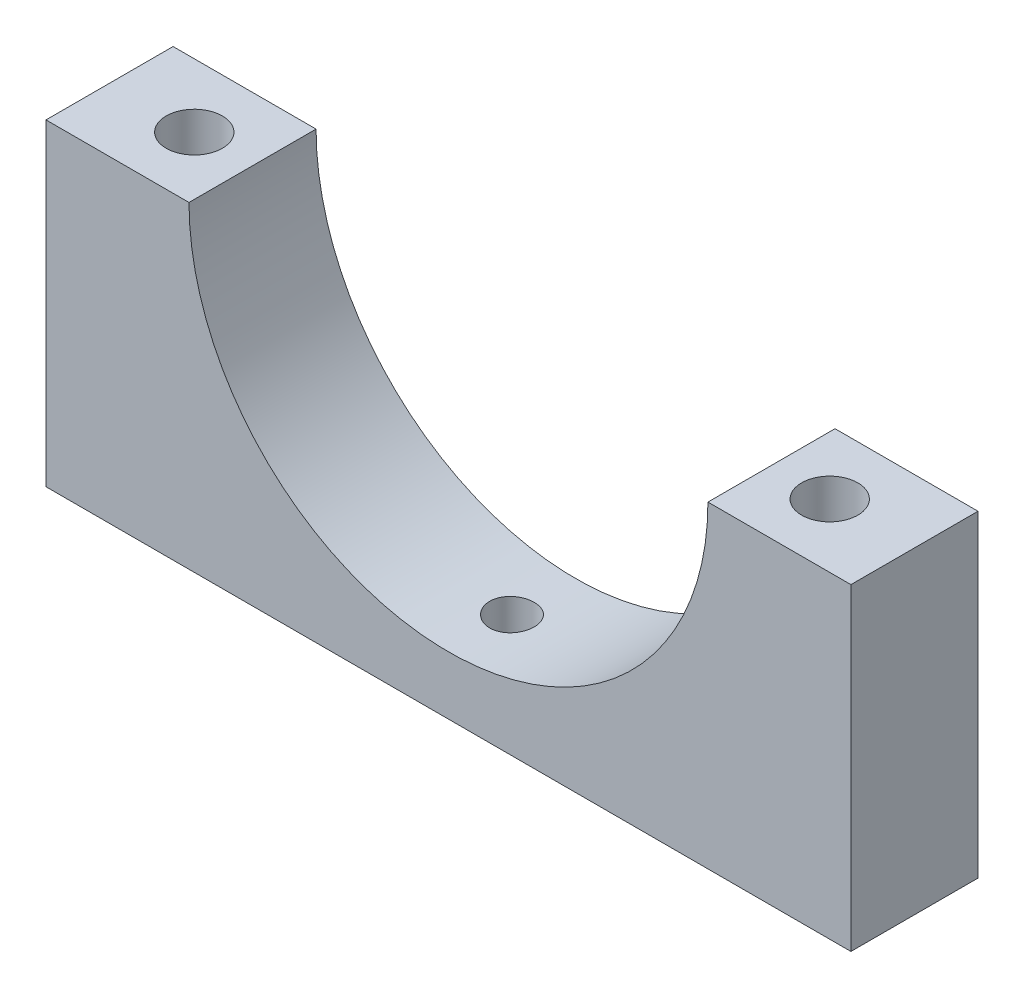
ISO-10303-21;
HEADER;
FILE_DESCRIPTION(('STEP AP214'),'2;1');
FILE_NAME('part.step','',(''),(''),'','','');
FILE_SCHEMA(('AUTOMOTIVE_DESIGN { 1 0 10303 214 1 1 1 1 }'));
ENDSEC;
DATA;
#1=APPLICATION_CONTEXT('core data for automotive mechanical design processes');
#2=APPLICATION_PROTOCOL_DEFINITION('international standard','automotive_design',2000,#1);
#3=PRODUCT_CONTEXT('',#1,'mechanical');
#4=PRODUCT('Part','Part','',(#3));
#5=PRODUCT_RELATED_PRODUCT_CATEGORY('part','',(#4));
#6=PRODUCT_DEFINITION_FORMATION('','',#4);
#7=PRODUCT_DEFINITION_CONTEXT('part definition',#1,'design');
#8=PRODUCT_DEFINITION('design','',#6,#7);
#9=PRODUCT_DEFINITION_SHAPE('','',#8);
#10=(LENGTH_UNIT() NAMED_UNIT(*) SI_UNIT(.MILLI.,.METRE.));
#11=(NAMED_UNIT(*) PLANE_ANGLE_UNIT() SI_UNIT($,.RADIAN.));
#12=(NAMED_UNIT(*) SI_UNIT($,.STERADIAN.) SOLID_ANGLE_UNIT());
#13=UNCERTAINTY_MEASURE_WITH_UNIT(LENGTH_MEASURE(1.E-05),#10,'distance_accuracy_value','');
#14=(GEOMETRIC_REPRESENTATION_CONTEXT(3) GLOBAL_UNCERTAINTY_ASSIGNED_CONTEXT((#13)) GLOBAL_UNIT_ASSIGNED_CONTEXT((#10,
#11,#12)) REPRESENTATION_CONTEXT('',''));
#15=CARTESIAN_POINT('',(0.,0.,0.));
#16=DIRECTION('',(0.,0.,1.));
#17=DIRECTION('',(1.,0.,0.));
#18=AXIS2_PLACEMENT_3D('',#15,#16,#17);
#19=CARTESIAN_POINT('',(-38.,0.,6.));
#20=DIRECTION('',(0.,1.,0.));
#21=DIRECTION('',(0.,0.,1.));
#22=AXIS2_PLACEMENT_3D('',#19,#20,#21);
#23=PLANE('',#22);
#24=CARTESIAN_POINT('',(-30.,0.,0.));
#25=DIRECTION('',(0.,-1.,0.));
#26=DIRECTION('',(0.,0.,-1.));
#27=AXIS2_PLACEMENT_3D('',#24,#25,#26);
#28=CIRCLE('',#27,2.64999999999999);
#29=CARTESIAN_POINT('',(-30.,0.,-2.64999999999999));
#30=VERTEX_POINT('',#29);
#31=EDGE_CURVE('E267',#30,#30,#28,.T.);
#32=ORIENTED_EDGE('',*,*,#31,.T.);
#33=EDGE_LOOP('',(#32));
#34=FACE_BOUND('',#33,.T.);
#35=DIRECTION('',(0.,0.,1.));
#36=VECTOR('',#35,1.);
#37=CARTESIAN_POINT('',(-24.5,0.,-6.001));
#38=LINE('',#37,#36);
#39=CARTESIAN_POINT('',(-24.5,0.,6.));
#40=VERTEX_POINT('',#39);
#41=CARTESIAN_POINT('',(-24.5,0.,-6.));
#42=VERTEX_POINT('',#41);
#43=EDGE_CURVE('E121',#40,#42,#38,.F.);
#44=ORIENTED_EDGE('',*,*,#43,.T.);
#45=DIRECTION('',(-1.,0.,0.));
#46=VECTOR('',#45,1.);
#47=CARTESIAN_POINT('',(-38.,0.,-6.));
#48=LINE('',#47,#46);
#49=CARTESIAN_POINT('',(-38.,0.,-6.));
#50=VERTEX_POINT('',#49);
#51=EDGE_CURVE('E97',#42,#50,#48,.T.);
#52=ORIENTED_EDGE('',*,*,#51,.T.);
#53=DIRECTION('',(0.,0.,1.));
#54=VECTOR('',#53,1.);
#55=CARTESIAN_POINT('',(-38.,0.,-6.));
#56=LINE('',#55,#54);
#57=CARTESIAN_POINT('',(-38.,0.,6.));
#58=VERTEX_POINT('',#57);
#59=EDGE_CURVE('E129',#50,#58,#56,.T.);
#60=ORIENTED_EDGE('',*,*,#59,.T.);
#61=DIRECTION('',(1.,0.,0.));
#62=VECTOR('',#61,1.);
#63=CARTESIAN_POINT('',(-38.,0.,6.));
#64=LINE('',#63,#62);
#65=EDGE_CURVE('E165',#58,#40,#64,.T.);
#66=ORIENTED_EDGE('',*,*,#65,.T.);
#67=EDGE_LOOP('',(#44,#52,#60,#66));
#68=FACE_BOUND('',#67,.T.);
#69=ADVANCED_FACE('F42',(#34,#68),#23,.T.);
#70=CARTESIAN_POINT('',(-38.,-30.,-6.));
#71=DIRECTION('',(-1.,0.,0.));
#72=DIRECTION('',(0.,0.,1.));
#73=AXIS2_PLACEMENT_3D('',#70,#71,#72);
#74=PLANE('',#73);
#75=ORIENTED_EDGE('',*,*,#59,.F.);
#76=DIRECTION('',(0.,1.,0.));
#77=VECTOR('',#76,1.);
#78=CARTESIAN_POINT('',(-38.,-30.,-6.));
#79=LINE('',#78,#77);
#80=CARTESIAN_POINT('',(-38.,-30.,-6.));
#81=VERTEX_POINT('',#80);
#82=EDGE_CURVE('E11',#81,#50,#79,.T.);
#83=ORIENTED_EDGE('',*,*,#82,.F.);
#84=DIRECTION('',(0.,0.,1.));
#85=VECTOR('',#84,1.);
#86=CARTESIAN_POINT('',(-38.,-30.,-6.));
#87=LINE('',#86,#85);
#88=CARTESIAN_POINT('',(-38.,-30.,6.));
#89=VERTEX_POINT('',#88);
#90=EDGE_CURVE('E136',#81,#89,#87,.T.);
#91=ORIENTED_EDGE('',*,*,#90,.T.);
#92=DIRECTION('',(0.,1.,0.));
#93=VECTOR('',#92,1.);
#94=CARTESIAN_POINT('',(-38.,-30.,6.));
#95=LINE('',#94,#93);
#96=EDGE_CURVE('E46',#89,#58,#95,.T.);
#97=ORIENTED_EDGE('',*,*,#96,.T.);
#98=EDGE_LOOP('',(#75,#83,#91,#97));
#99=FACE_BOUND('',#98,.T.);
#100=ADVANCED_FACE('F44',(#99),#74,.T.);
#101=CARTESIAN_POINT('',(-38.,-30.,-6.));
#102=DIRECTION('',(0.,0.,-1.));
#103=DIRECTION('',(-1.,0.,0.));
#104=AXIS2_PLACEMENT_3D('',#101,#102,#103);
#105=PLANE('',#104);
#106=CARTESIAN_POINT('',(0.,0.,-6.));
#107=DIRECTION('',(0.,0.,-1.));
#108=DIRECTION('',(-1.,0.,0.));
#109=AXIS2_PLACEMENT_3D('',#106,#107,#108);
#110=CIRCLE('',#109,24.5);
#111=CARTESIAN_POINT('',(24.5,0.,-6.));
#112=VERTEX_POINT('',#111);
#113=EDGE_CURVE('E116',#42,#112,#110,.F.);
#114=ORIENTED_EDGE('',*,*,#113,.T.);
#115=CARTESIAN_POINT('',(38.,0.,-6.));
#116=VERTEX_POINT('',#115);
#117=EDGE_CURVE('E127',#116,#112,#48,.T.);
#118=ORIENTED_EDGE('',*,*,#117,.F.);
#119=DIRECTION('',(0.,1.,0.));
#120=VECTOR('',#119,1.);
#121=CARTESIAN_POINT('',(38.,-30.,-6.));
#122=LINE('',#121,#120);
#123=CARTESIAN_POINT('',(38.,-30.,-6.));
#124=VERTEX_POINT('',#123);
#125=EDGE_CURVE('E52',#124,#116,#122,.T.);
#126=ORIENTED_EDGE('',*,*,#125,.F.);
#127=DIRECTION('',(-1.,0.,0.));
#128=VECTOR('',#127,1.);
#129=CARTESIAN_POINT('',(-38.,-30.,-6.));
#130=LINE('',#129,#128);
#131=EDGE_CURVE('E151',#124,#81,#130,.T.);
#132=ORIENTED_EDGE('',*,*,#131,.T.);
#133=ORIENTED_EDGE('',*,*,#82,.T.);
#134=ORIENTED_EDGE('',*,*,#51,.F.);
#135=EDGE_LOOP('',(#114,#118,#126,#132,#133,#134));
#136=FACE_BOUND('',#135,.T.);
#137=ADVANCED_FACE('F126',(#136),#105,.T.);
#138=CARTESIAN_POINT('',(38.,-30.,-6.));
#139=DIRECTION('',(1.,0.,0.));
#140=DIRECTION('',(0.,0.,-1.));
#141=AXIS2_PLACEMENT_3D('',#138,#139,#140);
#142=PLANE('',#141);
#143=DIRECTION('',(0.,0.,-1.));
#144=VECTOR('',#143,1.);
#145=CARTESIAN_POINT('',(38.,0.,-6.));
#146=LINE('',#145,#144);
#147=CARTESIAN_POINT('',(38.,0.,6.));
#148=VERTEX_POINT('',#147);
#149=EDGE_CURVE('E134',#148,#116,#146,.T.);
#150=ORIENTED_EDGE('',*,*,#149,.F.);
#151=DIRECTION('',(0.,1.,0.));
#152=VECTOR('',#151,1.);
#153=CARTESIAN_POINT('',(38.,-30.,6.));
#154=LINE('',#153,#152);
#155=CARTESIAN_POINT('',(38.,-30.,6.));
#156=VERTEX_POINT('',#155);
#157=EDGE_CURVE('E148',#156,#148,#154,.T.);
#158=ORIENTED_EDGE('',*,*,#157,.F.);
#159=DIRECTION('',(0.,0.,-1.));
#160=VECTOR('',#159,1.);
#161=CARTESIAN_POINT('',(38.,-30.,-6.));
#162=LINE('',#161,#160);
#163=EDGE_CURVE('E155',#156,#124,#162,.T.);
#164=ORIENTED_EDGE('',*,*,#163,.T.);
#165=ORIENTED_EDGE('',*,*,#125,.T.);
#166=EDGE_LOOP('',(#150,#158,#164,#165));
#167=FACE_BOUND('',#166,.T.);
#168=ADVANCED_FACE('F187',(#167),#142,.T.);
#169=CARTESIAN_POINT('',(-38.,-30.,6.));
#170=DIRECTION('',(0.,0.,1.));
#171=DIRECTION('',(1.,0.,0.));
#172=AXIS2_PLACEMENT_3D('',#169,#170,#171);
#173=PLANE('',#172);
#174=CARTESIAN_POINT('',(0.,0.,6.));
#175=DIRECTION('',(0.,0.,1.));
#176=DIRECTION('',(1.,0.,0.));
#177=AXIS2_PLACEMENT_3D('',#174,#175,#176);
#178=CIRCLE('',#177,24.5);
#179=CARTESIAN_POINT('',(24.5,0.,6.));
#180=VERTEX_POINT('',#179);
#181=EDGE_CURVE('E63',#40,#180,#178,.T.);
#182=ORIENTED_EDGE('',*,*,#181,.F.);
#183=ORIENTED_EDGE('',*,*,#65,.F.);
#184=ORIENTED_EDGE('',*,*,#96,.F.);
#185=DIRECTION('',(1.,0.,0.));
#186=VECTOR('',#185,1.);
#187=CARTESIAN_POINT('',(-38.,-30.,6.));
#188=LINE('',#187,#186);
#189=EDGE_CURVE('E141',#89,#156,#188,.T.);
#190=ORIENTED_EDGE('',*,*,#189,.T.);
#191=ORIENTED_EDGE('',*,*,#157,.T.);
#192=EDGE_CURVE('E164',#180,#148,#64,.T.);
#193=ORIENTED_EDGE('',*,*,#192,.F.);
#194=EDGE_LOOP('',(#182,#183,#184,#190,#191,#193));
#195=FACE_BOUND('',#194,.T.);
#196=ADVANCED_FACE('F171',(#195),#173,.T.);
#197=CARTESIAN_POINT('',(-38.,-30.,6.));
#198=DIRECTION('',(0.,1.,0.));
#199=DIRECTION('',(0.,0.,1.));
#200=AXIS2_PLACEMENT_3D('',#197,#198,#199);
#201=PLANE('',#200);
#202=CARTESIAN_POINT('',(-30.,-30.,0.));
#203=DIRECTION('',(0.,-1.,0.));
#204=DIRECTION('',(0.,0.,-1.));
#205=AXIS2_PLACEMENT_3D('',#202,#203,#204);
#206=CIRCLE('',#205,5.);
#207=CARTESIAN_POINT('',(-30.,-30.,-5.));
#208=VERTEX_POINT('',#207);
#209=EDGE_CURVE('E260',#208,#208,#206,.T.);
#210=ORIENTED_EDGE('',*,*,#209,.F.);
#211=EDGE_LOOP('',(#210));
#212=FACE_BOUND('',#211,.T.);
#213=CARTESIAN_POINT('',(30.,-30.,0.));
#214=DIRECTION('',(0.,-1.,0.));
#215=DIRECTION('',(0.,0.,-1.));
#216=AXIS2_PLACEMENT_3D('',#213,#214,#215);
#217=CIRCLE('',#216,5.);
#218=CARTESIAN_POINT('',(30.,-30.,-5.));
#219=VERTEX_POINT('',#218);
#220=EDGE_CURVE('E270',#219,#219,#217,.T.);
#221=ORIENTED_EDGE('',*,*,#220,.F.);
#222=EDGE_LOOP('',(#221));
#223=FACE_BOUND('',#222,.T.);
#224=CARTESIAN_POINT('',(0.,-30.,0.));
#225=DIRECTION('',(0.,-1.,0.));
#226=DIRECTION('',(0.,0.,-1.));
#227=AXIS2_PLACEMENT_3D('',#224,#225,#226);
#228=CIRCLE('',#227,2.09999999999999);
#229=CARTESIAN_POINT('',(0.,-30.,-2.09999999999999));
#230=VERTEX_POINT('',#229);
#231=EDGE_CURVE('E209',#230,#230,#228,.T.);
#232=ORIENTED_EDGE('',*,*,#231,.F.);
#233=EDGE_LOOP('',(#232));
#234=FACE_BOUND('',#233,.T.);
#235=ORIENTED_EDGE('',*,*,#90,.F.);
#236=ORIENTED_EDGE('',*,*,#131,.F.);
#237=ORIENTED_EDGE('',*,*,#163,.F.);
#238=ORIENTED_EDGE('',*,*,#189,.F.);
#239=EDGE_LOOP('',(#235,#236,#237,#238));
#240=FACE_BOUND('',#239,.T.);
#241=ADVANCED_FACE('F181',(#212,#223,#234,#240),#201,.F.);
#242=CARTESIAN_POINT('',(30.,0.,0.));
#243=DIRECTION('',(0.,-1.,0.));
#244=DIRECTION('',(0.,0.,-1.));
#245=AXIS2_PLACEMENT_3D('',#242,#243,#244);
#246=CIRCLE('',#245,2.64999999999999);
#247=CARTESIAN_POINT('',(30.,0.,-2.64999999999999));
#248=VERTEX_POINT('',#247);
#249=EDGE_CURVE('E207',#248,#248,#246,.T.);
#250=ORIENTED_EDGE('',*,*,#249,.T.);
#251=EDGE_LOOP('',(#250));
#252=FACE_BOUND('',#251,.T.);
#253=DIRECTION('',(0.,0.,1.));
#254=VECTOR('',#253,1.);
#255=CARTESIAN_POINT('',(24.5,0.,-6.001));
#256=LINE('',#255,#254);
#257=EDGE_CURVE('E113',#112,#180,#256,.T.);
#258=ORIENTED_EDGE('',*,*,#257,.T.);
#259=ORIENTED_EDGE('',*,*,#192,.T.);
#260=ORIENTED_EDGE('',*,*,#149,.T.);
#261=ORIENTED_EDGE('',*,*,#117,.T.);
#262=EDGE_LOOP('',(#258,#259,#260,#261));
#263=FACE_BOUND('',#262,.T.);
#264=ADVANCED_FACE('F132',(#252,#263),#23,.T.);
#265=CARTESIAN_POINT('',(0.,0.,-6.001));
#266=DIRECTION('',(0.,0.,1.));
#267=DIRECTION('',(1.,0.,0.));
#268=AXIS2_PLACEMENT_3D('',#265,#266,#267);
#269=CYLINDRICAL_SURFACE('',#268,24.5);
#270=CARTESIAN_POINT('',(0.,-24.5,-2.09999999999999));
#271=CARTESIAN_POINT('',(0.117726124194997,-24.4999988232626,-2.09999486347603));
#272=CARTESIAN_POINT('',(0.235532087485845,-24.4991424209062,-2.09006709639923));
#273=CARTESIAN_POINT('',(0.467883693471051,-24.4958084039188,-2.05060993636038));
#274=CARTESIAN_POINT('',(0.582425503465684,-24.4933289592788,-2.02105841672552));
#275=CARTESIAN_POINT('',(0.804850064232648,-24.4870290069592,-1.9432153515942));
#276=CARTESIAN_POINT('',(0.912736575734504,-24.4832092649605,-1.89493450407147));
#277=CARTESIAN_POINT('',(1.11884875006974,-24.4746569166632,-1.78102265882924));
#278=CARTESIAN_POINT('',(1.21707645413144,-24.469924503871,-1.71539533785722));
#279=CARTESIAN_POINT('',(1.40137216920466,-24.4600635088654,-1.56846319773548));
#280=CARTESIAN_POINT('',(1.48741063555307,-24.4549340091491,-1.48712137924035));
#281=CARTESIAN_POINT('',(1.64463199984254,-24.4448646504259,-1.31114753745084));
#282=CARTESIAN_POINT('',(1.71581424075497,-24.4399247998142,-1.21651492666988));
#283=CARTESIAN_POINT('',(1.84140326152398,-24.4307842568166,-1.01646596734014));
#284=CARTESIAN_POINT('',(1.89578395920088,-24.4265847179634,-0.911033187400522));
#285=CARTESIAN_POINT('',(1.98605962676027,-24.4194109253924,-0.692491172924309));
#286=CARTESIAN_POINT('',(2.02195494021531,-24.4164366489019,-0.579382081105195));
#287=CARTESIAN_POINT('',(2.07415492038546,-24.4120579416341,-0.348995048997501));
#288=CARTESIAN_POINT('',(2.0905078567627,-24.4106496434923,-0.231728120128663));
#289=CARTESIAN_POINT('',(2.10330801408843,-24.4095501560478,0.00389387903111961));
#290=CARTESIAN_POINT('',(2.09975562828684,-24.4098589328225,0.12224892777903));
#291=CARTESIAN_POINT('',(2.07288585919298,-24.4121551903397,0.356356454935274));
#292=CARTESIAN_POINT('',(2.04962096756116,-24.414138212749,0.472115007937306));
#293=CARTESIAN_POINT('',(1.98406815916716,-24.4195525350243,0.698078150871178));
#294=CARTESIAN_POINT('',(1.94178004717705,-24.4229838497534,0.808282683791353));
#295=CARTESIAN_POINT('',(1.83932254013891,-24.4309132639244,1.02017657167349));
#296=CARTESIAN_POINT('',(1.77912962899655,-24.4354127647388,1.12185450127848));
#297=CARTESIAN_POINT('',(1.64258812492112,-24.4449702904744,1.31368396332266));
#298=CARTESIAN_POINT('',(1.56623918556807,-24.4500283273706,1.40383524853932));
#299=CARTESIAN_POINT('',(1.39925864242145,-24.4601528478925,1.5703575452347));
#300=CARTESIAN_POINT('',(1.30858166498729,-24.4652193059656,1.64668306716807));
#301=CARTESIAN_POINT('',(1.1156772310723,-24.4747742454366,1.78303540595421));
#302=CARTESIAN_POINT('',(1.01344976627281,-24.4792627264182,1.84306221106854));
#303=CARTESIAN_POINT('',(0.800316395761191,-24.4871569130303,1.94511047632936));
#304=CARTESIAN_POINT('',(0.689409502040737,-24.4905624951668,1.98712988309763));
#305=CARTESIAN_POINT('',(0.462079254789843,-24.4959057756223,2.05193852965841));
#306=CARTESIAN_POINT('',(0.345656022447046,-24.4978435061725,2.07472819169971));
#307=CARTESIAN_POINT('',(0.110992175583779,-24.5000286168069,2.10037331146288));
#308=CARTESIAN_POINT('',(-0.00724152567329133,-24.5002813241619,2.10329159399681));
#309=CARTESIAN_POINT('',(-0.242516473137861,-24.4990821507046,2.08927575096427));
#310=CARTESIAN_POINT('',(-0.35955773111133,-24.4976302867278,2.07234182147349));
#311=CARTESIAN_POINT('',(-0.588945995091274,-24.4931886560791,2.0191543243645));
#312=CARTESIAN_POINT('',(-0.701299810893315,-24.4902012108084,1.98292991598588));
#313=CARTESIAN_POINT('',(-0.918334915718325,-24.4830239571928,1.89221954595406));
#314=CARTESIAN_POINT('',(-1.02301607661299,-24.4788341287746,1.83773327942444));
#315=CARTESIAN_POINT('',(-1.22202001717207,-24.46970837324,1.71188825293871));
#316=CARTESIAN_POINT('',(-1.31631642072638,-24.4647706186678,1.64048791793126));
#317=CARTESIAN_POINT('',(-1.49160776918517,-24.4547097726092,1.48290154605285));
#318=CARTESIAN_POINT('',(-1.57260246951387,-24.4495866777171,1.39671523737468));
#319=CARTESIAN_POINT('',(-1.71920711621508,-24.4397167512913,1.21173061118263));
#320=CARTESIAN_POINT('',(-1.78477603431305,-24.4349709449228,1.11289971550636));
#321=CARTESIAN_POINT('',(-1.89838644260389,-24.4264076089449,0.905593328484634));
#322=CARTESIAN_POINT('',(-1.94642811646902,-24.4225900696081,0.797117938221006));
#323=CARTESIAN_POINT('',(-2.02355057971947,-24.4163213548515,0.573746452213193));
#324=CARTESIAN_POINT('',(-2.05265639177095,-24.4138683768656,0.458859048589154));
#325=CARTESIAN_POINT('',(-2.09116235743432,-24.4106005521287,0.22580595983549));
#326=CARTESIAN_POINT('',(-2.10056291390133,-24.4097856718884,0.107640341775872));
#327=CARTESIAN_POINT('',(-2.09938674647158,-24.4098868265543,-0.128207145353237));
#328=CARTESIAN_POINT('',(-2.08887448468679,-24.4107972761974,-0.245889343650257));
#329=CARTESIAN_POINT('',(-2.04830559890022,-24.4142346334323,-0.477810149213752));
#330=CARTESIAN_POINT('',(-2.01824894599636,-24.4167615434145,-0.592048751387605));
#331=CARTESIAN_POINT('',(-1.93946100544503,-24.423145622158,-0.813843115101719));
#332=CARTESIAN_POINT('',(-1.89073098008951,-24.4270027010002,-0.921399327790474));
#333=CARTESIAN_POINT('',(-1.77598668896332,-24.4356126767906,-1.12681490305819));
#334=CARTESIAN_POINT('',(-1.70997267132733,-24.440365560878,-1.22467440481852));
#335=CARTESIAN_POINT('',(-1.56229200332191,-24.4502499379701,-1.40824869215775));
#336=CARTESIAN_POINT('',(-1.48057756511737,-24.4553825566753,-1.49392497311184));
#337=CARTESIAN_POINT('',(-1.30390372522855,-24.4654377955619,-1.6503816187369));
#338=CARTESIAN_POINT('',(-1.20894112790162,-24.4703603647012,-1.72115837906802));
#339=CARTESIAN_POINT('',(-1.00827345769676,-24.4794502528274,-1.84590757990892));
#340=CARTESIAN_POINT('',(-0.902547837181034,-24.4836160832773,-1.89984704724187));
#341=CARTESIAN_POINT('',(-0.683576232840501,-24.4907058676319,-1.98913874436706));
#342=CARTESIAN_POINT('',(-0.570339040639723,-24.4936312447226,-2.0245122861955));
#343=CARTESIAN_POINT('',(-0.380364426044851,-24.4971616179887,-2.06668384601498));
#344=CARTESIAN_POINT('',(-0.304847837694889,-24.4982211502015,-2.0791607371172));
#345=CARTESIAN_POINT('',(-0.152898725450864,-24.4996407223757,-2.0958204704966));
#346=CARTESIAN_POINT('',(-0.0764662041562561,-24.5000007643218,-2.10000333630697));
#347=CARTESIAN_POINT('',(0.,-24.5,-2.09999999999999));
#348=B_SPLINE_CURVE_WITH_KNOTS('',3,(#270,#271,#272,#273,#274,#275,#276,#277,#278,#279,#280,
#281,#282,#283,#284,#285,#286,#287,#288,#289,#290,#291,#292,#293,#294,#295,#296,#297,#298,#299,
#300,#301,#302,#303,#304,#305,#306,#307,#308,#309,#310,#311,#312,#313,#314,#315,#316,#317,#318,
#319,#320,#321,#322,#323,#324,#325,#326,#327,#328,#329,#330,#331,#332,#333,#334,#335,#336,#337,
#338,#339,#340,#341,#342,#343,#344,#345,#346,#347),.UNSPECIFIED.,.T.,.F.,(4,2,2,2,2,2,2,2,2,2,2,
2,2,2,2,2,2,2,2,2,2,2,2,2,2,2,2,2,2,2,2,2,2,2,2,2,2,2,4),(0.,0.352899182034522,
0.706196951112864,1.05929321705495,1.41231470087036,1.76617772310426,2.1200563919033,
2.47448168203189,2.82890038451335,3.18244185154665,3.53597633403278,3.8885723513155,
4.24117198723723,4.59423678647355,4.9473091569454,5.30152290304416,5.6557369042495,
6.00999128563051,6.36423788805353,6.71736399192347,7.07048660807802,7.42307695748278,
7.77567319357432,8.12914527811922,8.48262386115802,8.83703223012714,9.19143688505795,
9.54537225796345,9.89930039492788,10.2520847474258,10.6048696216195,10.9576306522907,
11.3103866188862,11.6642337933214,12.0181664687345,12.3727879788795,12.7270015197106,
12.956219440973,13.1854367118596),.UNSPECIFIED.);
#349=CARTESIAN_POINT('',(0.,-24.5,-2.09999999999999));
#350=VERTEX_POINT('',#349);
#351=EDGE_CURVE('E122',#350,#350,#348,.T.);
#352=ORIENTED_EDGE('',*,*,#351,.T.);
#353=EDGE_LOOP('',(#352));
#354=FACE_BOUND('',#353,.T.);
#355=ORIENTED_EDGE('',*,*,#181,.T.);
#356=ORIENTED_EDGE('',*,*,#257,.F.);
#357=ORIENTED_EDGE('',*,*,#113,.F.);
#358=ORIENTED_EDGE('',*,*,#43,.F.);
#359=EDGE_LOOP('',(#355,#356,#357,#358));
#360=FACE_BOUND('',#359,.T.);
#361=ADVANCED_FACE('F115',(#354,#360),#269,.F.);
#362=CARTESIAN_POINT('',(0.,-30.,0.));
#363=DIRECTION('',(0.,-1.,0.));
#364=DIRECTION('',(0.,0.,-1.));
#365=AXIS2_PLACEMENT_3D('',#362,#363,#364);
#366=CYLINDRICAL_SURFACE('',#365,2.09999999999999);
#367=ORIENTED_EDGE('',*,*,#351,.F.);
#368=EDGE_LOOP('',(#367));
#369=FACE_BOUND('',#368,.T.);
#370=ORIENTED_EDGE('',*,*,#231,.T.);
#371=EDGE_LOOP('',(#370));
#372=FACE_BOUND('',#371,.T.);
#373=ADVANCED_FACE('F201',(#369,#372),#366,.F.);
#374=CARTESIAN_POINT('',(30.,-30.,0.));
#375=DIRECTION('',(0.,-1.,0.));
#376=DIRECTION('',(0.,0.,-1.));
#377=AXIS2_PLACEMENT_3D('',#374,#375,#376);
#378=CYLINDRICAL_SURFACE('',#377,2.65);
#379=ORIENTED_EDGE('',*,*,#249,.F.);
#380=EDGE_LOOP('',(#379));
#381=FACE_BOUND('',#380,.T.);
#382=CARTESIAN_POINT('',(30.,-21.3,0.));
#383=DIRECTION('',(0.,-1.,0.));
#384=DIRECTION('',(0.,0.,-1.));
#385=AXIS2_PLACEMENT_3D('',#382,#383,#384);
#386=CIRCLE('',#385,2.65);
#387=CARTESIAN_POINT('',(30.,-21.3,-2.65));
#388=VERTEX_POINT('',#387);
#389=EDGE_CURVE('E210',#388,#388,#386,.T.);
#390=ORIENTED_EDGE('',*,*,#389,.T.);
#391=EDGE_LOOP('',(#390));
#392=FACE_BOUND('',#391,.T.);
#393=ADVANCED_FACE('F229',(#381,#392),#378,.F.);
#394=CARTESIAN_POINT('',(32.65,-21.3,0.));
#395=DIRECTION('',(0.,1.,0.));
#396=DIRECTION('',(0.,0.,1.));
#397=AXIS2_PLACEMENT_3D('',#394,#395,#396);
#398=PLANE('',#397);
#399=ORIENTED_EDGE('',*,*,#389,.F.);
#400=EDGE_LOOP('',(#399));
#401=FACE_BOUND('',#400,.T.);
#402=CARTESIAN_POINT('',(30.,-21.3,0.));
#403=DIRECTION('',(0.,-1.,0.));
#404=DIRECTION('',(0.,0.,-1.));
#405=AXIS2_PLACEMENT_3D('',#402,#403,#404);
#406=CIRCLE('',#405,5.);
#407=CARTESIAN_POINT('',(30.,-21.3,-5.));
#408=VERTEX_POINT('',#407);
#409=EDGE_CURVE('E216',#408,#408,#406,.T.);
#410=ORIENTED_EDGE('',*,*,#409,.T.);
#411=EDGE_LOOP('',(#410));
#412=FACE_BOUND('',#411,.T.);
#413=ADVANCED_FACE('F233',(#401,#412),#398,.F.);
#414=CARTESIAN_POINT('',(30.,-30.,0.));
#415=DIRECTION('',(0.,-1.,0.));
#416=DIRECTION('',(0.,0.,-1.));
#417=AXIS2_PLACEMENT_3D('',#414,#415,#416);
#418=CYLINDRICAL_SURFACE('',#417,5.);
#419=ORIENTED_EDGE('',*,*,#409,.F.);
#420=EDGE_LOOP('',(#419));
#421=FACE_BOUND('',#420,.T.);
#422=ORIENTED_EDGE('',*,*,#220,.T.);
#423=EDGE_LOOP('',(#422));
#424=FACE_BOUND('',#423,.T.);
#425=ADVANCED_FACE('F236',(#421,#424),#418,.F.);
#426=CARTESIAN_POINT('',(-30.,-30.,0.));
#427=DIRECTION('',(0.,-1.,0.));
#428=DIRECTION('',(0.,0.,-1.));
#429=AXIS2_PLACEMENT_3D('',#426,#427,#428);
#430=CYLINDRICAL_SURFACE('',#429,2.65);
#431=ORIENTED_EDGE('',*,*,#31,.F.);
#432=EDGE_LOOP('',(#431));
#433=FACE_BOUND('',#432,.T.);
#434=CARTESIAN_POINT('',(-30.,-21.3,0.));
#435=DIRECTION('',(0.,-1.,0.));
#436=DIRECTION('',(0.,0.,-1.));
#437=AXIS2_PLACEMENT_3D('',#434,#435,#436);
#438=CIRCLE('',#437,2.65);
#439=CARTESIAN_POINT('',(-30.,-21.3,-2.65));
#440=VERTEX_POINT('',#439);
#441=EDGE_CURVE('E262',#440,#440,#438,.T.);
#442=ORIENTED_EDGE('',*,*,#441,.T.);
#443=EDGE_LOOP('',(#442));
#444=FACE_BOUND('',#443,.T.);
#445=ADVANCED_FACE('F240',(#433,#444),#430,.F.);
#446=CARTESIAN_POINT('',(-27.35,-21.3,0.));
#447=DIRECTION('',(0.,1.,0.));
#448=DIRECTION('',(0.,0.,1.));
#449=AXIS2_PLACEMENT_3D('',#446,#447,#448);
#450=PLANE('',#449);
#451=ORIENTED_EDGE('',*,*,#441,.F.);
#452=EDGE_LOOP('',(#451));
#453=FACE_BOUND('',#452,.T.);
#454=CARTESIAN_POINT('',(-30.,-21.3,0.));
#455=DIRECTION('',(0.,-1.,0.));
#456=DIRECTION('',(0.,0.,-1.));
#457=AXIS2_PLACEMENT_3D('',#454,#455,#456);
#458=CIRCLE('',#457,5.);
#459=CARTESIAN_POINT('',(-30.,-21.3,-5.));
#460=VERTEX_POINT('',#459);
#461=EDGE_CURVE('E257',#460,#460,#458,.T.);
#462=ORIENTED_EDGE('',*,*,#461,.T.);
#463=EDGE_LOOP('',(#462));
#464=FACE_BOUND('',#463,.T.);
#465=ADVANCED_FACE('F244',(#453,#464),#450,.F.);
#466=CARTESIAN_POINT('',(-30.,-30.,0.));
#467=DIRECTION('',(0.,-1.,0.));
#468=DIRECTION('',(0.,0.,-1.));
#469=AXIS2_PLACEMENT_3D('',#466,#467,#468);
#470=CYLINDRICAL_SURFACE('',#469,5.);
#471=ORIENTED_EDGE('',*,*,#461,.F.);
#472=EDGE_LOOP('',(#471));
#473=FACE_BOUND('',#472,.T.);
#474=ORIENTED_EDGE('',*,*,#209,.T.);
#475=EDGE_LOOP('',(#474));
#476=FACE_BOUND('',#475,.T.);
#477=ADVANCED_FACE('F248',(#473,#476),#470,.F.);
#478=CLOSED_SHELL('',(#69,#100,#137,#168,#196,#241,#264,#361,#373,#393,#413,#425,#445,#465,#477));
#479=MANIFOLD_SOLID_BREP('B2',#478);
#480=ADVANCED_BREP_SHAPE_REPRESENTATION('',(#18,#479),#14);
#481=SHAPE_DEFINITION_REPRESENTATION(#9,#480);
ENDSEC;
END-ISO-10303-21;
